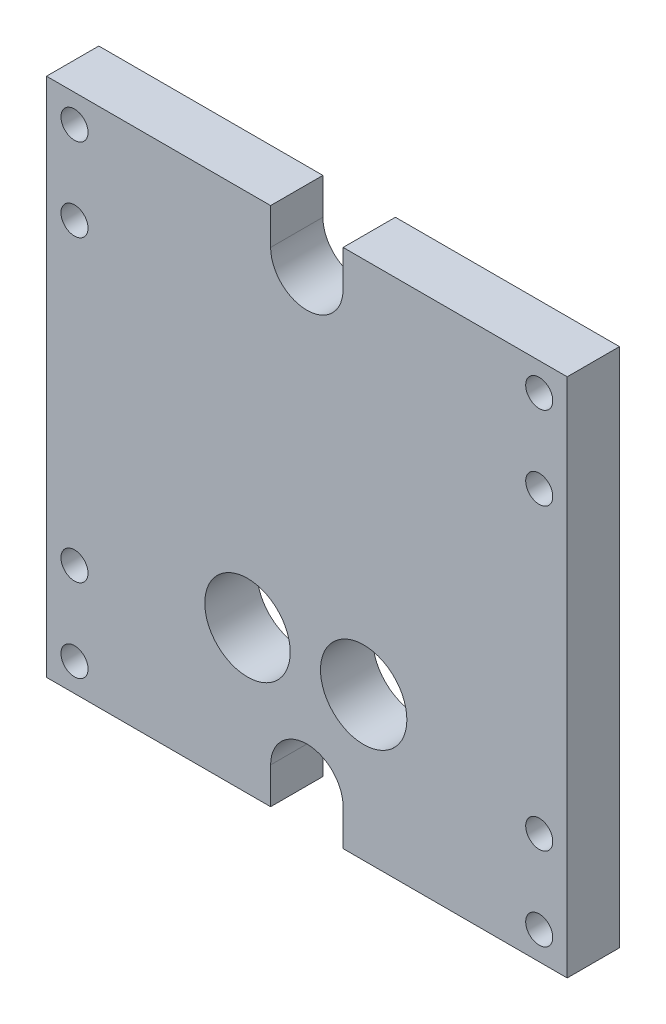
ISO-10303-21;
HEADER;
FILE_DESCRIPTION(('STEP AP214'),'2;1');
FILE_NAME('part.step','',(''),(''),'','','');
FILE_SCHEMA(('AUTOMOTIVE_DESIGN { 1 0 10303 214 1 1 1 1 }'));
ENDSEC;
DATA;
#1=APPLICATION_CONTEXT('core data for automotive mechanical design processes');
#2=APPLICATION_PROTOCOL_DEFINITION('international standard','automotive_design',2000,#1);
#3=PRODUCT_CONTEXT('',#1,'mechanical');
#4=PRODUCT('Part','Part','',(#3));
#5=PRODUCT_RELATED_PRODUCT_CATEGORY('part','',(#4));
#6=PRODUCT_DEFINITION_FORMATION('','',#4);
#7=PRODUCT_DEFINITION_CONTEXT('part definition',#1,'design');
#8=PRODUCT_DEFINITION('design','',#6,#7);
#9=PRODUCT_DEFINITION_SHAPE('','',#8);
#10=(LENGTH_UNIT() NAMED_UNIT(*) SI_UNIT(.MILLI.,.METRE.));
#11=(NAMED_UNIT(*) PLANE_ANGLE_UNIT() SI_UNIT($,.RADIAN.));
#12=(NAMED_UNIT(*) SI_UNIT($,.STERADIAN.) SOLID_ANGLE_UNIT());
#13=UNCERTAINTY_MEASURE_WITH_UNIT(LENGTH_MEASURE(1.E-05),#10,'distance_accuracy_value','');
#14=(GEOMETRIC_REPRESENTATION_CONTEXT(3) GLOBAL_UNCERTAINTY_ASSIGNED_CONTEXT((#13)) GLOBAL_UNIT_ASSIGNED_CONTEXT((#10,
#11,#12)) REPRESENTATION_CONTEXT('',''));
#15=CARTESIAN_POINT('',(0.,0.,0.));
#16=DIRECTION('',(0.,0.,1.));
#17=DIRECTION('',(1.,0.,0.));
#18=AXIS2_PLACEMENT_3D('',#15,#16,#17);
#19=CARTESIAN_POINT('',(0.244214263237684,42.9761421926462,10.));
#20=DIRECTION('',(0.,0.,-1.));
#21=DIRECTION('',(-1.,0.,0.));
#22=AXIS2_PLACEMENT_3D('',#19,#20,#21);
#23=CYLINDRICAL_SURFACE('',#22,6.935);
#24=CARTESIAN_POINT('',(0.244214263237684,42.9761421926462,0.));
#25=DIRECTION('',(0.,0.,1.));
#26=DIRECTION('',(1.,0.,0.));
#27=AXIS2_PLACEMENT_3D('',#24,#25,#26);
#28=CIRCLE('',#27,6.935);
#29=CARTESIAN_POINT('',(-6.69078573676231,42.9761421926462,0.));
#30=VERTEX_POINT('',#29);
#31=CARTESIAN_POINT('',(7.17921426323768,42.9761421926462,0.));
#32=VERTEX_POINT('',#31);
#33=EDGE_CURVE('E171',#30,#32,#28,.T.);
#34=ORIENTED_EDGE('',*,*,#33,.F.);
#35=DIRECTION('',(0.,0.,-1.));
#36=VECTOR('',#35,1.);
#37=CARTESIAN_POINT('',(-6.69078573676231,42.9761421926462,10.));
#38=LINE('',#37,#36);
#39=CARTESIAN_POINT('',(-6.69078573676231,42.9761421926462,10.));
#40=VERTEX_POINT('',#39);
#41=EDGE_CURVE('E11',#40,#30,#38,.T.);
#42=ORIENTED_EDGE('',*,*,#41,.F.);
#43=CARTESIAN_POINT('',(0.244214263237684,42.9761421926462,10.));
#44=DIRECTION('',(0.,0.,1.));
#45=DIRECTION('',(1.,0.,0.));
#46=AXIS2_PLACEMENT_3D('',#43,#44,#45);
#47=CIRCLE('',#46,6.935);
#48=CARTESIAN_POINT('',(7.17921426323768,42.9761421926462,10.));
#49=VERTEX_POINT('',#48);
#50=EDGE_CURVE('E163',#40,#49,#47,.T.);
#51=ORIENTED_EDGE('',*,*,#50,.T.);
#52=DIRECTION('',(0.,0.,-1.));
#53=VECTOR('',#52,1.);
#54=CARTESIAN_POINT('',(7.17921426323768,42.9761421926462,10.));
#55=LINE('',#54,#53);
#56=EDGE_CURVE('E51',#49,#32,#55,.T.);
#57=ORIENTED_EDGE('',*,*,#56,.T.);
#58=EDGE_LOOP('',(#34,#42,#51,#57));
#59=FACE_BOUND('',#58,.T.);
#60=ADVANCED_FACE('F35',(#59),#23,.F.);
#61=CARTESIAN_POINT('',(-6.69078573676231,0.,10.));
#62=DIRECTION('',(-1.,0.,0.));
#63=DIRECTION('',(0.,0.,1.));
#64=AXIS2_PLACEMENT_3D('',#61,#62,#63);
#65=PLANE('',#64);
#66=DIRECTION('',(0.,1.,0.));
#67=VECTOR('',#66,1.);
#68=CARTESIAN_POINT('',(-6.69078573676231,0.,0.));
#69=LINE('',#68,#67);
#70=CARTESIAN_POINT('',(-6.69078573676231,49.9111421926462,0.));
#71=VERTEX_POINT('',#70);
#72=EDGE_CURVE('E277',#30,#71,#69,.T.);
#73=ORIENTED_EDGE('',*,*,#72,.T.);
#74=DIRECTION('',(0.,0.,-1.));
#75=VECTOR('',#74,1.);
#76=CARTESIAN_POINT('',(-6.69078573676231,49.9111421926462,10.));
#77=LINE('',#76,#75);
#78=CARTESIAN_POINT('',(-6.69078573676231,49.9111421926462,10.));
#79=VERTEX_POINT('',#78);
#80=EDGE_CURVE('E43',#79,#71,#77,.T.);
#81=ORIENTED_EDGE('',*,*,#80,.F.);
#82=DIRECTION('',(0.,1.,0.));
#83=VECTOR('',#82,1.);
#84=CARTESIAN_POINT('',(-6.69078573676231,0.,10.));
#85=LINE('',#84,#83);
#86=EDGE_CURVE('E158',#40,#79,#85,.T.);
#87=ORIENTED_EDGE('',*,*,#86,.F.);
#88=ORIENTED_EDGE('',*,*,#41,.T.);
#89=EDGE_LOOP('',(#73,#81,#87,#88));
#90=FACE_BOUND('',#89,.T.);
#91=ADVANCED_FACE('F278',(#90),#65,.F.);
#92=CARTESIAN_POINT('',(0.,49.9111421926462,10.));
#93=DIRECTION('',(0.,1.,0.));
#94=DIRECTION('',(0.,0.,1.));
#95=AXIS2_PLACEMENT_3D('',#92,#93,#94);
#96=PLANE('',#95);
#97=DIRECTION('',(1.,0.,0.));
#98=VECTOR('',#97,1.);
#99=CARTESIAN_POINT('',(0.,49.9111421926462,0.));
#100=LINE('',#99,#98);
#101=CARTESIAN_POINT('',(-49.5557857367623,49.9111421926462,0.));
#102=VERTEX_POINT('',#101);
#103=EDGE_CURVE('E274',#102,#71,#100,.T.);
#104=ORIENTED_EDGE('',*,*,#103,.F.);
#105=DIRECTION('',(0.,0.,-1.));
#106=VECTOR('',#105,1.);
#107=CARTESIAN_POINT('',(-49.5557857367623,49.9111421926462,10.));
#108=LINE('',#107,#106);
#109=CARTESIAN_POINT('',(-49.5557857367623,49.9111421926462,10.));
#110=VERTEX_POINT('',#109);
#111=EDGE_CURVE('E269',#110,#102,#108,.T.);
#112=ORIENTED_EDGE('',*,*,#111,.F.);
#113=DIRECTION('',(1.,0.,0.));
#114=VECTOR('',#113,1.);
#115=CARTESIAN_POINT('',(0.,49.9111421926462,10.));
#116=LINE('',#115,#114);
#117=EDGE_CURVE('E151',#110,#79,#116,.T.);
#118=ORIENTED_EDGE('',*,*,#117,.T.);
#119=ORIENTED_EDGE('',*,*,#80,.T.);
#120=EDGE_LOOP('',(#104,#112,#118,#119));
#121=FACE_BOUND('',#120,.T.);
#122=ADVANCED_FACE('F272',(#121),#96,.T.);
#123=CARTESIAN_POINT('',(-49.5557857367623,0.,10.));
#124=DIRECTION('',(-1.,0.,0.));
#125=DIRECTION('',(0.,0.,1.));
#126=AXIS2_PLACEMENT_3D('',#123,#124,#125);
#127=PLANE('',#126);
#128=DIRECTION('',(0.,1.,0.));
#129=VECTOR('',#128,1.);
#130=CARTESIAN_POINT('',(-49.5557857367623,0.,0.));
#131=LINE('',#130,#129);
#132=CARTESIAN_POINT('',(-49.5557857367623,-49.6888578073537,0.));
#133=VERTEX_POINT('',#132);
#134=EDGE_CURVE('E282',#133,#102,#131,.T.);
#135=ORIENTED_EDGE('',*,*,#134,.F.);
#136=DIRECTION('',(0.,0.,-1.));
#137=VECTOR('',#136,1.);
#138=CARTESIAN_POINT('',(-49.5557857367623,-49.6888578073537,10.));
#139=LINE('',#138,#137);
#140=CARTESIAN_POINT('',(-49.5557857367623,-49.6888578073537,10.));
#141=VERTEX_POINT('',#140);
#142=EDGE_CURVE('E267',#141,#133,#139,.T.);
#143=ORIENTED_EDGE('',*,*,#142,.F.);
#144=DIRECTION('',(0.,1.,0.));
#145=VECTOR('',#144,1.);
#146=CARTESIAN_POINT('',(-49.5557857367623,0.,10.));
#147=LINE('',#146,#145);
#148=EDGE_CURVE('E157',#141,#110,#147,.T.);
#149=ORIENTED_EDGE('',*,*,#148,.T.);
#150=ORIENTED_EDGE('',*,*,#111,.T.);
#151=EDGE_LOOP('',(#135,#143,#149,#150));
#152=FACE_BOUND('',#151,.T.);
#153=ADVANCED_FACE('F345',(#152),#127,.T.);
#154=CARTESIAN_POINT('',(0.,-49.6888578073537,10.));
#155=DIRECTION('',(0.,1.,0.));
#156=DIRECTION('',(0.,0.,1.));
#157=AXIS2_PLACEMENT_3D('',#154,#155,#156);
#158=PLANE('',#157);
#159=DIRECTION('',(1.,0.,0.));
#160=VECTOR('',#159,1.);
#161=CARTESIAN_POINT('',(0.,-49.6888578073537,0.));
#162=LINE('',#161,#160);
#163=CARTESIAN_POINT('',(-6.69078573676231,-49.6888578073537,0.));
#164=VERTEX_POINT('',#163);
#165=EDGE_CURVE('E285',#133,#164,#162,.T.);
#166=ORIENTED_EDGE('',*,*,#165,.T.);
#167=DIRECTION('',(0.,0.,-1.));
#168=VECTOR('',#167,1.);
#169=CARTESIAN_POINT('',(-6.69078573676231,-49.6888578073537,10.));
#170=LINE('',#169,#168);
#171=CARTESIAN_POINT('',(-6.69078573676231,-49.6888578073537,10.));
#172=VERTEX_POINT('',#171);
#173=EDGE_CURVE('E265',#172,#164,#170,.T.);
#174=ORIENTED_EDGE('',*,*,#173,.F.);
#175=DIRECTION('',(1.,0.,0.));
#176=VECTOR('',#175,1.);
#177=CARTESIAN_POINT('',(0.,-49.6888578073537,10.));
#178=LINE('',#177,#176);
#179=EDGE_CURVE('E162',#141,#172,#178,.T.);
#180=ORIENTED_EDGE('',*,*,#179,.F.);
#181=ORIENTED_EDGE('',*,*,#142,.T.);
#182=EDGE_LOOP('',(#166,#174,#180,#181));
#183=FACE_BOUND('',#182,.T.);
#184=ADVANCED_FACE('F301',(#183),#158,.F.);
#185=CARTESIAN_POINT('',(-6.69078573676231,0.,10.));
#186=DIRECTION('',(1.,0.,0.));
#187=DIRECTION('',(0.,0.,-1.));
#188=AXIS2_PLACEMENT_3D('',#185,#186,#187);
#189=PLANE('',#188);
#190=DIRECTION('',(0.,-1.,0.));
#191=VECTOR('',#190,1.);
#192=CARTESIAN_POINT('',(-6.69078573676231,0.,0.));
#193=LINE('',#192,#191);
#194=CARTESIAN_POINT('',(-6.69078573676231,-42.7538578073538,0.));
#195=VERTEX_POINT('',#194);
#196=EDGE_CURVE('E296',#195,#164,#193,.T.);
#197=ORIENTED_EDGE('',*,*,#196,.F.);
#198=DIRECTION('',(0.,0.,-1.));
#199=VECTOR('',#198,1.);
#200=CARTESIAN_POINT('',(-6.69078573676231,-42.7538578073538,10.));
#201=LINE('',#200,#199);
#202=CARTESIAN_POINT('',(-6.69078573676231,-42.7538578073538,10.));
#203=VERTEX_POINT('',#202);
#204=EDGE_CURVE('E263',#203,#195,#201,.T.);
#205=ORIENTED_EDGE('',*,*,#204,.F.);
#206=DIRECTION('',(0.,-1.,0.));
#207=VECTOR('',#206,1.);
#208=CARTESIAN_POINT('',(-6.69078573676231,0.,10.));
#209=LINE('',#208,#207);
#210=EDGE_CURVE('E310',#203,#172,#209,.T.);
#211=ORIENTED_EDGE('',*,*,#210,.T.);
#212=ORIENTED_EDGE('',*,*,#173,.T.);
#213=EDGE_LOOP('',(#197,#205,#211,#212));
#214=FACE_BOUND('',#213,.T.);
#215=ADVANCED_FACE('F308',(#214),#189,.T.);
#216=CARTESIAN_POINT('',(0.2442142632377,-42.7538578073538,10.));
#217=DIRECTION('',(0.,0.,-1.));
#218=DIRECTION('',(-1.,0.,0.));
#219=AXIS2_PLACEMENT_3D('',#216,#217,#218);
#220=CYLINDRICAL_SURFACE('',#219,6.93499999999998);
#221=CARTESIAN_POINT('',(0.2442142632377,-42.7538578073538,0.));
#222=DIRECTION('',(0.,0.,1.));
#223=DIRECTION('',(1.,0.,0.));
#224=AXIS2_PLACEMENT_3D('',#221,#222,#223);
#225=CIRCLE('',#224,6.93499999999998);
#226=CARTESIAN_POINT('',(7.17921426323771,-42.7538578073538,0.));
#227=VERTEX_POINT('',#226);
#228=EDGE_CURVE('E293',#227,#195,#225,.T.);
#229=ORIENTED_EDGE('',*,*,#228,.F.);
#230=DIRECTION('',(0.,0.,-1.));
#231=VECTOR('',#230,1.);
#232=CARTESIAN_POINT('',(7.17921426323771,-42.7538578073538,10.));
#233=LINE('',#232,#231);
#234=CARTESIAN_POINT('',(7.17921426323771,-42.7538578073538,10.));
#235=VERTEX_POINT('',#234);
#236=EDGE_CURVE('E261',#235,#227,#233,.T.);
#237=ORIENTED_EDGE('',*,*,#236,.F.);
#238=CARTESIAN_POINT('',(0.2442142632377,-42.7538578073538,10.));
#239=DIRECTION('',(0.,0.,1.));
#240=DIRECTION('',(1.,0.,0.));
#241=AXIS2_PLACEMENT_3D('',#238,#239,#240);
#242=CIRCLE('',#241,6.93499999999998);
#243=EDGE_CURVE('E313',#235,#203,#242,.T.);
#244=ORIENTED_EDGE('',*,*,#243,.T.);
#245=ORIENTED_EDGE('',*,*,#204,.T.);
#246=EDGE_LOOP('',(#229,#237,#244,#245));
#247=FACE_BOUND('',#246,.T.);
#248=ADVANCED_FACE('F353',(#247),#220,.F.);
#249=CARTESIAN_POINT('',(7.17921426323771,0.,10.));
#250=DIRECTION('',(1.,0.,0.));
#251=DIRECTION('',(0.,0.,-1.));
#252=AXIS2_PLACEMENT_3D('',#249,#250,#251);
#253=PLANE('',#252);
#254=DIRECTION('',(0.,-1.,0.));
#255=VECTOR('',#254,1.);
#256=CARTESIAN_POINT('',(7.17921426323771,0.,0.));
#257=LINE('',#256,#255);
#258=CARTESIAN_POINT('',(7.17921426323771,-49.6888578073537,0.));
#259=VERTEX_POINT('',#258);
#260=EDGE_CURVE('E289',#227,#259,#257,.T.);
#261=ORIENTED_EDGE('',*,*,#260,.T.);
#262=DIRECTION('',(0.,0.,-1.));
#263=VECTOR('',#262,1.);
#264=CARTESIAN_POINT('',(7.17921426323771,-49.6888578073537,10.));
#265=LINE('',#264,#263);
#266=CARTESIAN_POINT('',(7.17921426323771,-49.6888578073537,10.));
#267=VERTEX_POINT('',#266);
#268=EDGE_CURVE('E258',#267,#259,#265,.T.);
#269=ORIENTED_EDGE('',*,*,#268,.F.);
#270=DIRECTION('',(0.,-1.,0.));
#271=VECTOR('',#270,1.);
#272=CARTESIAN_POINT('',(7.17921426323771,0.,10.));
#273=LINE('',#272,#271);
#274=EDGE_CURVE('E315',#235,#267,#273,.T.);
#275=ORIENTED_EDGE('',*,*,#274,.F.);
#276=ORIENTED_EDGE('',*,*,#236,.T.);
#277=EDGE_LOOP('',(#261,#269,#275,#276));
#278=FACE_BOUND('',#277,.T.);
#279=ADVANCED_FACE('F356',(#278),#253,.F.);
#280=CARTESIAN_POINT('',(50.0442142632377,-49.6888578073537,0.));
#281=VERTEX_POINT('',#280);
#282=EDGE_CURVE('E287',#259,#281,#162,.T.);
#283=ORIENTED_EDGE('',*,*,#282,.T.);
#284=DIRECTION('',(0.,0.,-1.));
#285=VECTOR('',#284,1.);
#286=CARTESIAN_POINT('',(50.0442142632377,-49.6888578073537,10.));
#287=LINE('',#286,#285);
#288=CARTESIAN_POINT('',(50.0442142632377,-49.6888578073537,10.));
#289=VERTEX_POINT('',#288);
#290=EDGE_CURVE('E146',#289,#281,#287,.T.);
#291=ORIENTED_EDGE('',*,*,#290,.F.);
#292=EDGE_CURVE('E134',#267,#289,#178,.T.);
#293=ORIENTED_EDGE('',*,*,#292,.F.);
#294=ORIENTED_EDGE('',*,*,#268,.T.);
#295=EDGE_LOOP('',(#283,#291,#293,#294));
#296=FACE_BOUND('',#295,.T.);
#297=ADVANCED_FACE('F360',(#296),#158,.F.);
#298=CARTESIAN_POINT('',(50.0442142632377,0.,10.));
#299=DIRECTION('',(-1.,0.,0.));
#300=DIRECTION('',(0.,0.,1.));
#301=AXIS2_PLACEMENT_3D('',#298,#299,#300);
#302=PLANE('',#301);
#303=DIRECTION('',(0.,1.,0.));
#304=VECTOR('',#303,1.);
#305=CARTESIAN_POINT('',(50.0442142632377,0.,0.));
#306=LINE('',#305,#304);
#307=CARTESIAN_POINT('',(50.0442142632377,49.9111421926462,0.));
#308=VERTEX_POINT('',#307);
#309=EDGE_CURVE('E143',#281,#308,#306,.T.);
#310=ORIENTED_EDGE('',*,*,#309,.T.);
#311=DIRECTION('',(0.,0.,-1.));
#312=VECTOR('',#311,1.);
#313=CARTESIAN_POINT('',(50.0442142632377,49.9111421926462,10.));
#314=LINE('',#313,#312);
#315=CARTESIAN_POINT('',(50.0442142632377,49.9111421926462,10.));
#316=VERTEX_POINT('',#315);
#317=EDGE_CURVE('E140',#316,#308,#314,.T.);
#318=ORIENTED_EDGE('',*,*,#317,.F.);
#319=DIRECTION('',(0.,1.,0.));
#320=VECTOR('',#319,1.);
#321=CARTESIAN_POINT('',(50.0442142632377,0.,10.));
#322=LINE('',#321,#320);
#323=EDGE_CURVE('E125',#289,#316,#322,.T.);
#324=ORIENTED_EDGE('',*,*,#323,.F.);
#325=ORIENTED_EDGE('',*,*,#290,.T.);
#326=EDGE_LOOP('',(#310,#318,#324,#325));
#327=FACE_BOUND('',#326,.T.);
#328=ADVANCED_FACE('F141',(#327),#302,.F.);
#329=CARTESIAN_POINT('',(7.17921426323768,49.9111421926462,0.));
#330=VERTEX_POINT('',#329);
#331=EDGE_CURVE('E284',#330,#308,#100,.T.);
#332=ORIENTED_EDGE('',*,*,#331,.F.);
#333=DIRECTION('',(0.,0.,-1.));
#334=VECTOR('',#333,1.);
#335=CARTESIAN_POINT('',(7.17921426323768,49.9111421926462,10.));
#336=LINE('',#335,#334);
#337=CARTESIAN_POINT('',(7.17921426323768,49.9111421926462,10.));
#338=VERTEX_POINT('',#337);
#339=EDGE_CURVE('E88',#338,#330,#336,.T.);
#340=ORIENTED_EDGE('',*,*,#339,.F.);
#341=EDGE_CURVE('E132',#338,#316,#116,.T.);
#342=ORIENTED_EDGE('',*,*,#341,.T.);
#343=ORIENTED_EDGE('',*,*,#317,.T.);
#344=EDGE_LOOP('',(#332,#340,#342,#343));
#345=FACE_BOUND('',#344,.T.);
#346=ADVANCED_FACE('F148',(#345),#96,.T.);
#347=CARTESIAN_POINT('',(11.1125,-22.225,10.));
#348=DIRECTION('',(0.,0.,-1.));
#349=DIRECTION('',(-1.,0.,0.));
#350=AXIS2_PLACEMENT_3D('',#347,#348,#349);
#351=CYLINDRICAL_SURFACE('',#350,8.26323292786717);
#352=CARTESIAN_POINT('',(11.1125,-22.225,10.));
#353=DIRECTION('',(0.,0.,1.));
#354=DIRECTION('',(1.,0.,0.));
#355=AXIS2_PLACEMENT_3D('',#352,#353,#354);
#356=CIRCLE('',#355,8.26323292786717);
#357=CARTESIAN_POINT('',(19.3757329278672,-22.225,10.));
#358=VERTEX_POINT('',#357);
#359=EDGE_CURVE('E152',#358,#358,#356,.T.);
#360=ORIENTED_EDGE('',*,*,#359,.T.);
#361=EDGE_LOOP('',(#360));
#362=FACE_BOUND('',#361,.T.);
#363=CARTESIAN_POINT('',(11.1125,-22.225,0.));
#364=DIRECTION('',(0.,0.,1.));
#365=DIRECTION('',(1.,0.,0.));
#366=AXIS2_PLACEMENT_3D('',#363,#364,#365);
#367=CIRCLE('',#366,8.26323292786717);
#368=CARTESIAN_POINT('',(19.3757329278672,-22.225,0.));
#369=VERTEX_POINT('',#368);
#370=EDGE_CURVE('E245',#369,#369,#367,.T.);
#371=ORIENTED_EDGE('',*,*,#370,.F.);
#372=EDGE_LOOP('',(#371));
#373=FACE_BOUND('',#372,.T.);
#374=ADVANCED_FACE('F368',(#362,#373),#351,.F.);
#375=CARTESIAN_POINT('',(7.17921426323768,0.,10.));
#376=DIRECTION('',(-1.,0.,0.));
#377=DIRECTION('',(0.,0.,1.));
#378=AXIS2_PLACEMENT_3D('',#375,#376,#377);
#379=PLANE('',#378);
#380=DIRECTION('',(0.,1.,0.));
#381=VECTOR('',#380,1.);
#382=CARTESIAN_POINT('',(7.17921426323768,0.,0.));
#383=LINE('',#382,#381);
#384=EDGE_CURVE('E250',#32,#330,#383,.T.);
#385=ORIENTED_EDGE('',*,*,#384,.F.);
#386=ORIENTED_EDGE('',*,*,#56,.F.);
#387=DIRECTION('',(0.,1.,0.));
#388=VECTOR('',#387,1.);
#389=CARTESIAN_POINT('',(7.17921426323768,0.,10.));
#390=LINE('',#389,#388);
#391=EDGE_CURVE('E149',#49,#338,#390,.T.);
#392=ORIENTED_EDGE('',*,*,#391,.T.);
#393=ORIENTED_EDGE('',*,*,#339,.T.);
#394=EDGE_LOOP('',(#385,#386,#392,#393));
#395=FACE_BOUND('',#394,.T.);
#396=ADVANCED_FACE('F334',(#395),#379,.T.);
#397=CARTESIAN_POINT('',(-11.1125,-22.225,10.));
#398=DIRECTION('',(0.,0.,-1.));
#399=DIRECTION('',(-1.,0.,0.));
#400=AXIS2_PLACEMENT_3D('',#397,#398,#399);
#401=CYLINDRICAL_SURFACE('',#400,8.17225743538657);
#402=CARTESIAN_POINT('',(-11.1125,-22.225,10.));
#403=DIRECTION('',(0.,0.,1.));
#404=DIRECTION('',(1.,0.,0.));
#405=AXIS2_PLACEMENT_3D('',#402,#403,#404);
#406=CIRCLE('',#405,8.17225743538657);
#407=CARTESIAN_POINT('',(-2.94024256461343,-22.225,10.));
#408=VERTEX_POINT('',#407);
#409=EDGE_CURVE('E255',#408,#408,#406,.T.);
#410=ORIENTED_EDGE('',*,*,#409,.T.);
#411=EDGE_LOOP('',(#410));
#412=FACE_BOUND('',#411,.T.);
#413=CARTESIAN_POINT('',(-11.1125,-22.225,0.));
#414=DIRECTION('',(0.,0.,1.));
#415=DIRECTION('',(1.,0.,0.));
#416=AXIS2_PLACEMENT_3D('',#413,#414,#415);
#417=CIRCLE('',#416,8.17225743538657);
#418=CARTESIAN_POINT('',(-2.94024256461343,-22.225,0.));
#419=VERTEX_POINT('',#418);
#420=EDGE_CURVE('E165',#419,#419,#417,.T.);
#421=ORIENTED_EDGE('',*,*,#420,.F.);
#422=EDGE_LOOP('',(#421));
#423=FACE_BOUND('',#422,.T.);
#424=ADVANCED_FACE('F326',(#412,#423),#401,.F.);
#425=CARTESIAN_POINT('',(0.,0.,10.));
#426=DIRECTION('',(0.,0.,1.));
#427=DIRECTION('',(1.,0.,0.));
#428=AXIS2_PLACEMENT_3D('',#425,#426,#427);
#429=PLANE('',#428);
#430=CARTESIAN_POINT('',(-44.2057857367623,-44.3388578073537,10.));
#431=DIRECTION('',(0.,0.,-1.));
#432=DIRECTION('',(-1.,0.,0.));
#433=AXIS2_PLACEMENT_3D('',#430,#431,#432);
#434=CIRCLE('',#433,2.5908);
#435=CARTESIAN_POINT('',(-46.7965857367623,-44.3388578073537,10.));
#436=VERTEX_POINT('',#435);
#437=EDGE_CURVE('E211',#436,#436,#434,.T.);
#438=ORIENTED_EDGE('',*,*,#437,.T.);
#439=EDGE_LOOP('',(#438));
#440=FACE_BOUND('',#439,.T.);
#441=CARTESIAN_POINT('',(44.6942142632377,-44.3388578073537,10.));
#442=DIRECTION('',(0.,0.,-1.));
#443=DIRECTION('',(-1.,0.,0.));
#444=AXIS2_PLACEMENT_3D('',#441,#442,#443);
#445=CIRCLE('',#444,2.5908);
#446=CARTESIAN_POINT('',(42.1034142632377,-44.3388578073537,10.));
#447=VERTEX_POINT('',#446);
#448=EDGE_CURVE('E205',#447,#447,#445,.T.);
#449=ORIENTED_EDGE('',*,*,#448,.T.);
#450=EDGE_LOOP('',(#449));
#451=FACE_BOUND('',#450,.T.);
#452=CARTESIAN_POINT('',(44.6942142632377,44.5611421926463,10.));
#453=DIRECTION('',(0.,0.,-1.));
#454=DIRECTION('',(-1.,0.,0.));
#455=AXIS2_PLACEMENT_3D('',#452,#453,#454);
#456=CIRCLE('',#455,2.5908);
#457=CARTESIAN_POINT('',(42.1034142632377,44.5611421926463,10.));
#458=VERTEX_POINT('',#457);
#459=EDGE_CURVE('E199',#458,#458,#456,.T.);
#460=ORIENTED_EDGE('',*,*,#459,.T.);
#461=EDGE_LOOP('',(#460));
#462=FACE_BOUND('',#461,.T.);
#463=CARTESIAN_POINT('',(-44.2057857367623,44.5611421926463,10.));
#464=DIRECTION('',(0.,0.,-1.));
#465=DIRECTION('',(-1.,0.,0.));
#466=AXIS2_PLACEMENT_3D('',#463,#464,#465);
#467=CIRCLE('',#466,2.5908);
#468=CARTESIAN_POINT('',(-46.7965857367623,44.5611421926463,10.));
#469=VERTEX_POINT('',#468);
#470=EDGE_CURVE('E193',#469,#469,#467,.T.);
#471=ORIENTED_EDGE('',*,*,#470,.T.);
#472=EDGE_LOOP('',(#471));
#473=FACE_BOUND('',#472,.T.);
#474=CARTESIAN_POINT('',(-44.2057857367623,28.6861421926463,10.));
#475=DIRECTION('',(0.,0.,-1.));
#476=DIRECTION('',(-1.,0.,0.));
#477=AXIS2_PLACEMENT_3D('',#474,#475,#476);
#478=CIRCLE('',#477,2.5908);
#479=CARTESIAN_POINT('',(-46.7965857367623,28.6861421926463,10.));
#480=VERTEX_POINT('',#479);
#481=EDGE_CURVE('E187',#480,#480,#478,.T.);
#482=ORIENTED_EDGE('',*,*,#481,.T.);
#483=EDGE_LOOP('',(#482));
#484=FACE_BOUND('',#483,.T.);
#485=CARTESIAN_POINT('',(-44.2057857367623,-28.4638578073538,10.));
#486=DIRECTION('',(0.,0.,-1.));
#487=DIRECTION('',(-1.,0.,0.));
#488=AXIS2_PLACEMENT_3D('',#485,#486,#487);
#489=CIRCLE('',#488,2.5908);
#490=CARTESIAN_POINT('',(-46.7965857367623,-28.4638578073538,10.));
#491=VERTEX_POINT('',#490);
#492=EDGE_CURVE('E181',#491,#491,#489,.T.);
#493=ORIENTED_EDGE('',*,*,#492,.T.);
#494=EDGE_LOOP('',(#493));
#495=FACE_BOUND('',#494,.T.);
#496=CARTESIAN_POINT('',(44.6942142632377,-28.4638578073538,10.));
#497=DIRECTION('',(0.,0.,-1.));
#498=DIRECTION('',(-1.,0.,0.));
#499=AXIS2_PLACEMENT_3D('',#496,#497,#498);
#500=CIRCLE('',#499,2.5908);
#501=CARTESIAN_POINT('',(42.1034142632377,-28.4638578073538,10.));
#502=VERTEX_POINT('',#501);
#503=EDGE_CURVE('E175',#502,#502,#500,.T.);
#504=ORIENTED_EDGE('',*,*,#503,.T.);
#505=EDGE_LOOP('',(#504));
#506=FACE_BOUND('',#505,.T.);
#507=CARTESIAN_POINT('',(44.6942142632377,28.6861421926463,10.));
#508=DIRECTION('',(0.,0.,-1.));
#509=DIRECTION('',(-1.,0.,0.));
#510=AXIS2_PLACEMENT_3D('',#507,#508,#509);
#511=CIRCLE('',#510,2.5908);
#512=CARTESIAN_POINT('',(42.1034142632377,28.6861421926463,10.));
#513=VERTEX_POINT('',#512);
#514=EDGE_CURVE('E168',#513,#513,#511,.T.);
#515=ORIENTED_EDGE('',*,*,#514,.T.);
#516=EDGE_LOOP('',(#515));
#517=FACE_BOUND('',#516,.T.);
#518=ORIENTED_EDGE('',*,*,#50,.F.);
#519=ORIENTED_EDGE('',*,*,#86,.T.);
#520=ORIENTED_EDGE('',*,*,#117,.F.);
#521=ORIENTED_EDGE('',*,*,#148,.F.);
#522=ORIENTED_EDGE('',*,*,#179,.T.);
#523=ORIENTED_EDGE('',*,*,#210,.F.);
#524=ORIENTED_EDGE('',*,*,#243,.F.);
#525=ORIENTED_EDGE('',*,*,#274,.T.);
#526=ORIENTED_EDGE('',*,*,#292,.T.);
#527=ORIENTED_EDGE('',*,*,#323,.T.);
#528=ORIENTED_EDGE('',*,*,#341,.F.);
#529=ORIENTED_EDGE('',*,*,#391,.F.);
#530=EDGE_LOOP('',(#518,#519,#520,#521,#522,#523,#524,#525,#526,#527,#528,#529));
#531=FACE_BOUND('',#530,.T.);
#532=ORIENTED_EDGE('',*,*,#359,.F.);
#533=EDGE_LOOP('',(#532));
#534=FACE_BOUND('',#533,.T.);
#535=ORIENTED_EDGE('',*,*,#409,.F.);
#536=EDGE_LOOP('',(#535));
#537=FACE_BOUND('',#536,.T.);
#538=ADVANCED_FACE('F128',(#440,#451,#462,#473,#484,#495,#506,#517,#531,#534,#537),#429,.T.);
#539=CARTESIAN_POINT('',(0.,0.,0.));
#540=DIRECTION('',(0.,0.,1.));
#541=DIRECTION('',(1.,0.,0.));
#542=AXIS2_PLACEMENT_3D('',#539,#540,#541);
#543=PLANE('',#542);
#544=CARTESIAN_POINT('',(-44.2057857367623,-44.3388578073537,0.));
#545=DIRECTION('',(0.,0.,-1.));
#546=DIRECTION('',(-1.,0.,0.));
#547=AXIS2_PLACEMENT_3D('',#544,#545,#546);
#548=CIRCLE('',#547,2.5908);
#549=CARTESIAN_POINT('',(-46.7965857367623,-44.3388578073537,0.));
#550=VERTEX_POINT('',#549);
#551=EDGE_CURVE('E214',#550,#550,#548,.T.);
#552=ORIENTED_EDGE('',*,*,#551,.F.);
#553=EDGE_LOOP('',(#552));
#554=FACE_BOUND('',#553,.T.);
#555=CARTESIAN_POINT('',(44.6942142632377,-44.3388578073537,0.));
#556=DIRECTION('',(0.,0.,-1.));
#557=DIRECTION('',(-1.,0.,0.));
#558=AXIS2_PLACEMENT_3D('',#555,#556,#557);
#559=CIRCLE('',#558,2.5908);
#560=CARTESIAN_POINT('',(42.1034142632377,-44.3388578073537,0.));
#561=VERTEX_POINT('',#560);
#562=EDGE_CURVE('E208',#561,#561,#559,.T.);
#563=ORIENTED_EDGE('',*,*,#562,.F.);
#564=EDGE_LOOP('',(#563));
#565=FACE_BOUND('',#564,.T.);
#566=CARTESIAN_POINT('',(44.6942142632377,44.5611421926463,0.));
#567=DIRECTION('',(0.,0.,-1.));
#568=DIRECTION('',(-1.,0.,0.));
#569=AXIS2_PLACEMENT_3D('',#566,#567,#568);
#570=CIRCLE('',#569,2.5908);
#571=CARTESIAN_POINT('',(42.1034142632377,44.5611421926463,0.));
#572=VERTEX_POINT('',#571);
#573=EDGE_CURVE('E202',#572,#572,#570,.T.);
#574=ORIENTED_EDGE('',*,*,#573,.F.);
#575=EDGE_LOOP('',(#574));
#576=FACE_BOUND('',#575,.T.);
#577=CARTESIAN_POINT('',(-44.2057857367623,44.5611421926463,0.));
#578=DIRECTION('',(0.,0.,-1.));
#579=DIRECTION('',(-1.,0.,0.));
#580=AXIS2_PLACEMENT_3D('',#577,#578,#579);
#581=CIRCLE('',#580,2.5908);
#582=CARTESIAN_POINT('',(-46.7965857367623,44.5611421926463,0.));
#583=VERTEX_POINT('',#582);
#584=EDGE_CURVE('E196',#583,#583,#581,.T.);
#585=ORIENTED_EDGE('',*,*,#584,.F.);
#586=EDGE_LOOP('',(#585));
#587=FACE_BOUND('',#586,.T.);
#588=CARTESIAN_POINT('',(-44.2057857367623,28.6861421926463,0.));
#589=DIRECTION('',(0.,0.,-1.));
#590=DIRECTION('',(-1.,0.,0.));
#591=AXIS2_PLACEMENT_3D('',#588,#589,#590);
#592=CIRCLE('',#591,2.5908);
#593=CARTESIAN_POINT('',(-46.7965857367623,28.6861421926463,0.));
#594=VERTEX_POINT('',#593);
#595=EDGE_CURVE('E190',#594,#594,#592,.T.);
#596=ORIENTED_EDGE('',*,*,#595,.F.);
#597=EDGE_LOOP('',(#596));
#598=FACE_BOUND('',#597,.T.);
#599=CARTESIAN_POINT('',(-44.2057857367623,-28.4638578073538,0.));
#600=DIRECTION('',(0.,0.,-1.));
#601=DIRECTION('',(-1.,0.,0.));
#602=AXIS2_PLACEMENT_3D('',#599,#600,#601);
#603=CIRCLE('',#602,2.5908);
#604=CARTESIAN_POINT('',(-46.7965857367623,-28.4638578073538,0.));
#605=VERTEX_POINT('',#604);
#606=EDGE_CURVE('E184',#605,#605,#603,.T.);
#607=ORIENTED_EDGE('',*,*,#606,.F.);
#608=EDGE_LOOP('',(#607));
#609=FACE_BOUND('',#608,.T.);
#610=CARTESIAN_POINT('',(44.6942142632377,-28.4638578073538,0.));
#611=DIRECTION('',(0.,0.,-1.));
#612=DIRECTION('',(-1.,0.,0.));
#613=AXIS2_PLACEMENT_3D('',#610,#611,#612);
#614=CIRCLE('',#613,2.5908);
#615=CARTESIAN_POINT('',(42.1034142632377,-28.4638578073538,0.));
#616=VERTEX_POINT('',#615);
#617=EDGE_CURVE('E178',#616,#616,#614,.T.);
#618=ORIENTED_EDGE('',*,*,#617,.F.);
#619=EDGE_LOOP('',(#618));
#620=FACE_BOUND('',#619,.T.);
#621=CARTESIAN_POINT('',(44.6942142632377,28.6861421926463,0.));
#622=DIRECTION('',(0.,0.,-1.));
#623=DIRECTION('',(-1.,0.,0.));
#624=AXIS2_PLACEMENT_3D('',#621,#622,#623);
#625=CIRCLE('',#624,2.5908);
#626=CARTESIAN_POINT('',(42.1034142632377,28.6861421926463,0.));
#627=VERTEX_POINT('',#626);
#628=EDGE_CURVE('E172',#627,#627,#625,.T.);
#629=ORIENTED_EDGE('',*,*,#628,.F.);
#630=EDGE_LOOP('',(#629));
#631=FACE_BOUND('',#630,.T.);
#632=ORIENTED_EDGE('',*,*,#33,.T.);
#633=ORIENTED_EDGE('',*,*,#384,.T.);
#634=ORIENTED_EDGE('',*,*,#331,.T.);
#635=ORIENTED_EDGE('',*,*,#309,.F.);
#636=ORIENTED_EDGE('',*,*,#282,.F.);
#637=ORIENTED_EDGE('',*,*,#260,.F.);
#638=ORIENTED_EDGE('',*,*,#228,.T.);
#639=ORIENTED_EDGE('',*,*,#196,.T.);
#640=ORIENTED_EDGE('',*,*,#165,.F.);
#641=ORIENTED_EDGE('',*,*,#134,.T.);
#642=ORIENTED_EDGE('',*,*,#103,.T.);
#643=ORIENTED_EDGE('',*,*,#72,.F.);
#644=EDGE_LOOP('',(#632,#633,#634,#635,#636,#637,#638,#639,#640,#641,#642,#643));
#645=FACE_BOUND('',#644,.T.);
#646=ORIENTED_EDGE('',*,*,#370,.T.);
#647=EDGE_LOOP('',(#646));
#648=FACE_BOUND('',#647,.T.);
#649=ORIENTED_EDGE('',*,*,#420,.T.);
#650=EDGE_LOOP('',(#649));
#651=FACE_BOUND('',#650,.T.);
#652=ADVANCED_FACE('F220',(#554,#565,#576,#587,#598,#609,#620,#631,#645,#648,#651),#543,.F.);
#653=CARTESIAN_POINT('',(44.6942142632377,28.6861421926463,0.));
#654=DIRECTION('',(0.,0.,-1.));
#655=DIRECTION('',(-1.,0.,0.));
#656=AXIS2_PLACEMENT_3D('',#653,#654,#655);
#657=CYLINDRICAL_SURFACE('',#656,2.5908);
#658=ORIENTED_EDGE('',*,*,#514,.F.);
#659=EDGE_LOOP('',(#658));
#660=FACE_BOUND('',#659,.T.);
#661=ORIENTED_EDGE('',*,*,#628,.T.);
#662=EDGE_LOOP('',(#661));
#663=FACE_BOUND('',#662,.T.);
#664=ADVANCED_FACE('F223',(#660,#663),#657,.F.);
#665=CARTESIAN_POINT('',(44.6942142632377,-28.4638578073538,0.));
#666=DIRECTION('',(0.,0.,-1.));
#667=DIRECTION('',(-1.,0.,0.));
#668=AXIS2_PLACEMENT_3D('',#665,#666,#667);
#669=CYLINDRICAL_SURFACE('',#668,2.5908);
#670=ORIENTED_EDGE('',*,*,#503,.F.);
#671=EDGE_LOOP('',(#670));
#672=FACE_BOUND('',#671,.T.);
#673=ORIENTED_EDGE('',*,*,#617,.T.);
#674=EDGE_LOOP('',(#673));
#675=FACE_BOUND('',#674,.T.);
#676=ADVANCED_FACE('F410',(#672,#675),#669,.F.);
#677=CARTESIAN_POINT('',(-44.2057857367623,-28.4638578073538,0.));
#678=DIRECTION('',(0.,0.,-1.));
#679=DIRECTION('',(-1.,0.,0.));
#680=AXIS2_PLACEMENT_3D('',#677,#678,#679);
#681=CYLINDRICAL_SURFACE('',#680,2.5908);
#682=ORIENTED_EDGE('',*,*,#492,.F.);
#683=EDGE_LOOP('',(#682));
#684=FACE_BOUND('',#683,.T.);
#685=ORIENTED_EDGE('',*,*,#606,.T.);
#686=EDGE_LOOP('',(#685));
#687=FACE_BOUND('',#686,.T.);
#688=ADVANCED_FACE('F419',(#684,#687),#681,.F.);
#689=CARTESIAN_POINT('',(-44.2057857367623,28.6861421926463,0.));
#690=DIRECTION('',(0.,0.,-1.));
#691=DIRECTION('',(-1.,0.,0.));
#692=AXIS2_PLACEMENT_3D('',#689,#690,#691);
#693=CYLINDRICAL_SURFACE('',#692,2.5908);
#694=ORIENTED_EDGE('',*,*,#481,.F.);
#695=EDGE_LOOP('',(#694));
#696=FACE_BOUND('',#695,.T.);
#697=ORIENTED_EDGE('',*,*,#595,.T.);
#698=EDGE_LOOP('',(#697));
#699=FACE_BOUND('',#698,.T.);
#700=ADVANCED_FACE('F429',(#696,#699),#693,.F.);
#701=CARTESIAN_POINT('',(-44.2057857367623,44.5611421926463,0.));
#702=DIRECTION('',(0.,0.,-1.));
#703=DIRECTION('',(-1.,0.,0.));
#704=AXIS2_PLACEMENT_3D('',#701,#702,#703);
#705=CYLINDRICAL_SURFACE('',#704,2.5908);
#706=ORIENTED_EDGE('',*,*,#470,.F.);
#707=EDGE_LOOP('',(#706));
#708=FACE_BOUND('',#707,.T.);
#709=ORIENTED_EDGE('',*,*,#584,.T.);
#710=EDGE_LOOP('',(#709));
#711=FACE_BOUND('',#710,.T.);
#712=ADVANCED_FACE('F439',(#708,#711),#705,.F.);
#713=CARTESIAN_POINT('',(44.6942142632377,44.5611421926463,0.));
#714=DIRECTION('',(0.,0.,-1.));
#715=DIRECTION('',(-1.,0.,0.));
#716=AXIS2_PLACEMENT_3D('',#713,#714,#715);
#717=CYLINDRICAL_SURFACE('',#716,2.5908);
#718=ORIENTED_EDGE('',*,*,#459,.F.);
#719=EDGE_LOOP('',(#718));
#720=FACE_BOUND('',#719,.T.);
#721=ORIENTED_EDGE('',*,*,#573,.T.);
#722=EDGE_LOOP('',(#721));
#723=FACE_BOUND('',#722,.T.);
#724=ADVANCED_FACE('F449',(#720,#723),#717,.F.);
#725=CARTESIAN_POINT('',(44.6942142632377,-44.3388578073537,0.));
#726=DIRECTION('',(0.,0.,-1.));
#727=DIRECTION('',(-1.,0.,0.));
#728=AXIS2_PLACEMENT_3D('',#725,#726,#727);
#729=CYLINDRICAL_SURFACE('',#728,2.5908);
#730=ORIENTED_EDGE('',*,*,#448,.F.);
#731=EDGE_LOOP('',(#730));
#732=FACE_BOUND('',#731,.T.);
#733=ORIENTED_EDGE('',*,*,#562,.T.);
#734=EDGE_LOOP('',(#733));
#735=FACE_BOUND('',#734,.T.);
#736=ADVANCED_FACE('F459',(#732,#735),#729,.F.);
#737=CARTESIAN_POINT('',(-44.2057857367623,-44.3388578073537,0.));
#738=DIRECTION('',(0.,0.,-1.));
#739=DIRECTION('',(-1.,0.,0.));
#740=AXIS2_PLACEMENT_3D('',#737,#738,#739);
#741=CYLINDRICAL_SURFACE('',#740,2.5908);
#742=ORIENTED_EDGE('',*,*,#437,.F.);
#743=EDGE_LOOP('',(#742));
#744=FACE_BOUND('',#743,.T.);
#745=ORIENTED_EDGE('',*,*,#551,.T.);
#746=EDGE_LOOP('',(#745));
#747=FACE_BOUND('',#746,.T.);
#748=ADVANCED_FACE('F218',(#744,#747),#741,.F.);
#749=CLOSED_SHELL('',(#60,#91,#122,#153,#184,#215,#248,#279,#297,#328,#346,#374,#396,#424,#538,
#652,#664,#676,#688,#700,#712,#724,#736,#748));
#750=MANIFOLD_SOLID_BREP('B2',#749);
#751=ADVANCED_BREP_SHAPE_REPRESENTATION('',(#18,#750),#14);
#752=SHAPE_DEFINITION_REPRESENTATION(#9,#751);
ENDSEC;
END-ISO-10303-21;
